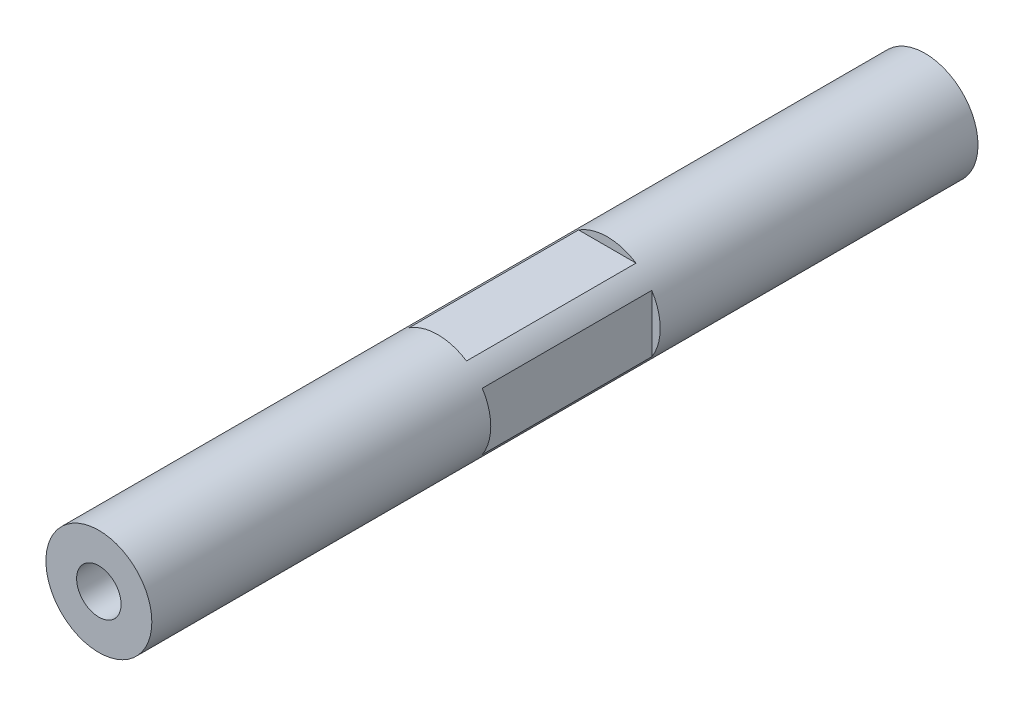
ISO-10303-21;
HEADER;
FILE_DESCRIPTION(('STEP AP214'),'2;1');
FILE_NAME('part.step','',(''),(''),'','','');
FILE_SCHEMA(('AUTOMOTIVE_DESIGN { 1 0 10303 214 1 1 1 1 }'));
ENDSEC;
DATA;
#1=APPLICATION_CONTEXT('core data for automotive mechanical design processes');
#2=APPLICATION_PROTOCOL_DEFINITION('international standard','automotive_design',2000,#1);
#3=PRODUCT_CONTEXT('',#1,'mechanical');
#4=PRODUCT('Part','Part','',(#3));
#5=PRODUCT_RELATED_PRODUCT_CATEGORY('part','',(#4));
#6=PRODUCT_DEFINITION_FORMATION('','',#4);
#7=PRODUCT_DEFINITION_CONTEXT('part definition',#1,'design');
#8=PRODUCT_DEFINITION('design','',#6,#7);
#9=PRODUCT_DEFINITION_SHAPE('','',#8);
#10=(LENGTH_UNIT() NAMED_UNIT(*) SI_UNIT(.MILLI.,.METRE.));
#11=(NAMED_UNIT(*) PLANE_ANGLE_UNIT() SI_UNIT($,.RADIAN.));
#12=(NAMED_UNIT(*) SI_UNIT($,.STERADIAN.) SOLID_ANGLE_UNIT());
#13=UNCERTAINTY_MEASURE_WITH_UNIT(LENGTH_MEASURE(1.E-05),#10,'distance_accuracy_value','');
#14=(GEOMETRIC_REPRESENTATION_CONTEXT(3) GLOBAL_UNCERTAINTY_ASSIGNED_CONTEXT((#13)) GLOBAL_UNIT_ASSIGNED_CONTEXT((#10,
#11,#12)) REPRESENTATION_CONTEXT('',''));
#15=CARTESIAN_POINT('',(0.,0.,0.));
#16=DIRECTION('',(0.,0.,1.));
#17=DIRECTION('',(1.,0.,0.));
#18=AXIS2_PLACEMENT_3D('',#15,#16,#17);
#19=CARTESIAN_POINT('',(0.,0.,78.));
#20=DIRECTION('',(0.,0.,-1.));
#21=DIRECTION('',(-1.,0.,0.));
#22=AXIS2_PLACEMENT_3D('',#19,#20,#21);
#23=CYLINDRICAL_SURFACE('',#22,5.);
#24=CARTESIAN_POINT('',(0.,0.,46.));
#25=DIRECTION('',(0.,0.,-1.));
#26=DIRECTION('',(-1.,0.,0.));
#27=AXIS2_PLACEMENT_3D('',#24,#25,#26);
#28=CIRCLE('',#27,5.);
#29=CARTESIAN_POINT('',(4.2,2.71293199325011,46.));
#30=VERTEX_POINT('',#29);
#31=CARTESIAN_POINT('',(4.2,-2.71293199325011,46.));
#32=VERTEX_POINT('',#31);
#33=EDGE_CURVE('E108',#30,#32,#28,.T.);
#34=ORIENTED_EDGE('',*,*,#33,.F.);
#35=DIRECTION('',(0.,0.,-1.));
#36=VECTOR('',#35,1.);
#37=CARTESIAN_POINT('',(4.2,2.71293199325011,78.));
#38=LINE('',#37,#36);
#39=CARTESIAN_POINT('',(4.2,2.71293199325011,30.));
#40=VERTEX_POINT('',#39);
#41=EDGE_CURVE('E122',#40,#30,#38,.F.);
#42=ORIENTED_EDGE('',*,*,#41,.F.);
#43=CARTESIAN_POINT('',(0.,0.,30.));
#44=DIRECTION('',(0.,0.,-1.));
#45=DIRECTION('',(-1.,0.,0.));
#46=AXIS2_PLACEMENT_3D('',#43,#44,#45);
#47=CIRCLE('',#46,5.);
#48=CARTESIAN_POINT('',(4.2,-2.71293199325011,30.));
#49=VERTEX_POINT('',#48);
#50=EDGE_CURVE('E124',#40,#49,#47,.T.);
#51=ORIENTED_EDGE('',*,*,#50,.T.);
#52=DIRECTION('',(0.,0.,-1.));
#53=VECTOR('',#52,1.);
#54=CARTESIAN_POINT('',(4.2,-2.71293199325011,78.));
#55=LINE('',#54,#53);
#56=EDGE_CURVE('E120',#32,#49,#55,.T.);
#57=ORIENTED_EDGE('',*,*,#56,.F.);
#58=EDGE_LOOP('',(#34,#42,#51,#57));
#59=FACE_BOUND('',#58,.T.);
#60=DIRECTION('',(0.,0.,-1.));
#61=VECTOR('',#60,1.);
#62=CARTESIAN_POINT('',(2.71293199325011,4.2,78.));
#63=LINE('',#62,#61);
#64=CARTESIAN_POINT('',(2.71293199325011,4.2,46.));
#65=VERTEX_POINT('',#64);
#66=CARTESIAN_POINT('',(2.71293199325011,4.2,30.));
#67=VERTEX_POINT('',#66);
#68=EDGE_CURVE('E130',#65,#67,#63,.T.);
#69=ORIENTED_EDGE('',*,*,#68,.F.);
#70=CARTESIAN_POINT('',(0.,0.,46.));
#71=DIRECTION('',(0.,0.,1.));
#72=DIRECTION('',(1.,0.,0.));
#73=AXIS2_PLACEMENT_3D('',#70,#71,#72);
#74=CIRCLE('',#73,5.);
#75=CARTESIAN_POINT('',(-2.71293199325011,4.2,46.));
#76=VERTEX_POINT('',#75);
#77=EDGE_CURVE('E127',#65,#76,#74,.T.);
#78=ORIENTED_EDGE('',*,*,#77,.T.);
#79=DIRECTION('',(0.,0.,-1.));
#80=VECTOR('',#79,1.);
#81=CARTESIAN_POINT('',(-2.71293199325011,4.2,78.));
#82=LINE('',#81,#80);
#83=CARTESIAN_POINT('',(-2.71293199325011,4.2,30.));
#84=VERTEX_POINT('',#83);
#85=EDGE_CURVE('E133',#84,#76,#82,.F.);
#86=ORIENTED_EDGE('',*,*,#85,.F.);
#87=CARTESIAN_POINT('',(0.,0.,30.));
#88=DIRECTION('',(0.,0.,1.));
#89=DIRECTION('',(1.,0.,0.));
#90=AXIS2_PLACEMENT_3D('',#87,#88,#89);
#91=CIRCLE('',#90,5.);
#92=EDGE_CURVE('E135',#67,#84,#91,.T.);
#93=ORIENTED_EDGE('',*,*,#92,.F.);
#94=EDGE_LOOP('',(#69,#78,#86,#93));
#95=FACE_BOUND('',#94,.T.);
#96=DIRECTION('',(0.,0.,-1.));
#97=VECTOR('',#96,1.);
#98=CARTESIAN_POINT('',(-4.2,2.71293199325011,78.));
#99=LINE('',#98,#97);
#100=CARTESIAN_POINT('',(-4.2,2.71293199325011,46.));
#101=VERTEX_POINT('',#100);
#102=CARTESIAN_POINT('',(-4.2,2.71293199325011,30.));
#103=VERTEX_POINT('',#102);
#104=EDGE_CURVE('E140',#101,#103,#99,.T.);
#105=ORIENTED_EDGE('',*,*,#104,.F.);
#106=CARTESIAN_POINT('',(0.,0.,46.));
#107=DIRECTION('',(0.,0.,1.));
#108=DIRECTION('',(1.,0.,0.));
#109=AXIS2_PLACEMENT_3D('',#106,#107,#108);
#110=CIRCLE('',#109,5.);
#111=CARTESIAN_POINT('',(-4.2,-2.71293199325011,46.));
#112=VERTEX_POINT('',#111);
#113=EDGE_CURVE('E137',#101,#112,#110,.T.);
#114=ORIENTED_EDGE('',*,*,#113,.T.);
#115=DIRECTION('',(0.,0.,-1.));
#116=VECTOR('',#115,1.);
#117=CARTESIAN_POINT('',(-4.2,-2.71293199325011,78.));
#118=LINE('',#117,#116);
#119=CARTESIAN_POINT('',(-4.2,-2.71293199325011,30.));
#120=VERTEX_POINT('',#119);
#121=EDGE_CURVE('E143',#120,#112,#118,.F.);
#122=ORIENTED_EDGE('',*,*,#121,.F.);
#123=CARTESIAN_POINT('',(0.,0.,30.));
#124=DIRECTION('',(0.,0.,1.));
#125=DIRECTION('',(1.,0.,0.));
#126=AXIS2_PLACEMENT_3D('',#123,#124,#125);
#127=CIRCLE('',#126,5.);
#128=EDGE_CURVE('E145',#103,#120,#127,.T.);
#129=ORIENTED_EDGE('',*,*,#128,.F.);
#130=EDGE_LOOP('',(#105,#114,#122,#129));
#131=FACE_BOUND('',#130,.T.);
#132=CARTESIAN_POINT('',(0.,0.,78.));
#133=DIRECTION('',(0.,0.,1.));
#134=DIRECTION('',(1.,0.,0.));
#135=AXIS2_PLACEMENT_3D('',#132,#133,#134);
#136=CIRCLE('',#135,5.);
#137=CARTESIAN_POINT('',(5.,0.,78.));
#138=VERTEX_POINT('',#137);
#139=EDGE_CURVE('E147',#138,#138,#136,.T.);
#140=ORIENTED_EDGE('',*,*,#139,.F.);
#141=EDGE_LOOP('',(#140));
#142=FACE_BOUND('',#141,.T.);
#143=CARTESIAN_POINT('',(0.,0.,0.));
#144=DIRECTION('',(0.,0.,1.));
#145=DIRECTION('',(1.,0.,0.));
#146=AXIS2_PLACEMENT_3D('',#143,#144,#145);
#147=CIRCLE('',#146,5.);
#148=CARTESIAN_POINT('',(5.,0.,0.));
#149=VERTEX_POINT('',#148);
#150=EDGE_CURVE('E148',#149,#149,#147,.T.);
#151=ORIENTED_EDGE('',*,*,#150,.T.);
#152=EDGE_LOOP('',(#151));
#153=FACE_BOUND('',#152,.T.);
#154=CARTESIAN_POINT('',(0.,0.,46.));
#155=DIRECTION('',(0.,0.,-1.));
#156=DIRECTION('',(-1.,0.,0.));
#157=AXIS2_PLACEMENT_3D('',#154,#155,#156);
#158=CIRCLE('',#157,5.);
#159=CARTESIAN_POINT('',(2.71293199325011,-4.2,46.));
#160=VERTEX_POINT('',#159);
#161=CARTESIAN_POINT('',(-2.71293199325011,-4.2,46.));
#162=VERTEX_POINT('',#161);
#163=EDGE_CURVE('E11',#160,#162,#158,.T.);
#164=ORIENTED_EDGE('',*,*,#163,.F.);
#165=DIRECTION('',(0.,0.,-1.));
#166=VECTOR('',#165,1.);
#167=CARTESIAN_POINT('',(2.71293199325011,-4.2,78.));
#168=LINE('',#167,#166);
#169=CARTESIAN_POINT('',(2.71293199325011,-4.2,30.));
#170=VERTEX_POINT('',#169);
#171=EDGE_CURVE('E107',#170,#160,#168,.F.);
#172=ORIENTED_EDGE('',*,*,#171,.F.);
#173=CARTESIAN_POINT('',(0.,0.,30.));
#174=DIRECTION('',(0.,0.,-1.));
#175=DIRECTION('',(-1.,0.,0.));
#176=AXIS2_PLACEMENT_3D('',#173,#174,#175);
#177=CIRCLE('',#176,5.);
#178=CARTESIAN_POINT('',(-2.71293199325011,-4.2,30.));
#179=VERTEX_POINT('',#178);
#180=EDGE_CURVE('E102',#170,#179,#177,.T.);
#181=ORIENTED_EDGE('',*,*,#180,.T.);
#182=DIRECTION('',(0.,0.,-1.));
#183=VECTOR('',#182,1.);
#184=CARTESIAN_POINT('',(-2.71293199325011,-4.2,78.));
#185=LINE('',#184,#183);
#186=EDGE_CURVE('E42',#162,#179,#185,.T.);
#187=ORIENTED_EDGE('',*,*,#186,.F.);
#188=EDGE_LOOP('',(#164,#172,#181,#187));
#189=FACE_BOUND('',#188,.T.);
#190=ADVANCED_FACE('F35',(#59,#95,#131,#142,#153,#189),#23,.T.);
#191=CARTESIAN_POINT('',(0.,0.,78.));
#192=DIRECTION('',(0.,0.,1.));
#193=DIRECTION('',(1.,0.,0.));
#194=AXIS2_PLACEMENT_3D('',#191,#192,#193);
#195=PLANE('',#194);
#196=CARTESIAN_POINT('',(0.,0.,78.));
#197=DIRECTION('',(0.,0.,1.));
#198=DIRECTION('',(1.,0.,0.));
#199=AXIS2_PLACEMENT_3D('',#196,#197,#198);
#200=CIRCLE('',#199,2.1);
#201=CARTESIAN_POINT('',(2.1,0.,78.));
#202=VERTEX_POINT('',#201);
#203=EDGE_CURVE('E156',#202,#202,#200,.T.);
#204=ORIENTED_EDGE('',*,*,#203,.F.);
#205=EDGE_LOOP('',(#204));
#206=FACE_BOUND('',#205,.T.);
#207=ORIENTED_EDGE('',*,*,#139,.T.);
#208=EDGE_LOOP('',(#207));
#209=FACE_BOUND('',#208,.T.);
#210=ADVANCED_FACE('F191',(#206,#209),#195,.T.);
#211=CARTESIAN_POINT('',(0.,0.,0.));
#212=DIRECTION('',(0.,0.,1.));
#213=DIRECTION('',(1.,0.,0.));
#214=AXIS2_PLACEMENT_3D('',#211,#212,#213);
#215=PLANE('',#214);
#216=CARTESIAN_POINT('',(0.,0.,0.));
#217=DIRECTION('',(0.,0.,-1.));
#218=DIRECTION('',(-1.,0.,0.));
#219=AXIS2_PLACEMENT_3D('',#216,#217,#218);
#220=CIRCLE('',#219,2.09999999999999);
#221=CARTESIAN_POINT('',(-2.09999999999999,0.,0.));
#222=VERTEX_POINT('',#221);
#223=EDGE_CURVE('E162',#222,#222,#220,.T.);
#224=ORIENTED_EDGE('',*,*,#223,.F.);
#225=EDGE_LOOP('',(#224));
#226=FACE_BOUND('',#225,.T.);
#227=ORIENTED_EDGE('',*,*,#150,.F.);
#228=EDGE_LOOP('',(#227));
#229=FACE_BOUND('',#228,.T.);
#230=ADVANCED_FACE('F196',(#226,#229),#215,.F.);
#231=CARTESIAN_POINT('',(0.,0.,65.6));
#232=DIRECTION('',(0.,0.,1.));
#233=DIRECTION('',(1.,0.,0.));
#234=AXIS2_PLACEMENT_3D('',#231,#232,#233);
#235=CONICAL_SURFACE('',#234,2.1,1.02974425867666);
#236=CARTESIAN_POINT('',(0.,0.,64.3381927000421));
#237=VERTEX_POINT('',#236);
#238=VERTEX_LOOP('',#237);
#239=FACE_BOUND('',#238,.T.);
#240=CARTESIAN_POINT('',(0.,0.,65.6));
#241=DIRECTION('',(0.,0.,1.));
#242=DIRECTION('',(1.,0.,0.));
#243=AXIS2_PLACEMENT_3D('',#240,#241,#242);
#244=CIRCLE('',#243,2.1);
#245=CARTESIAN_POINT('',(2.1,0.,65.6));
#246=VERTEX_POINT('',#245);
#247=EDGE_CURVE('E151',#246,#246,#244,.T.);
#248=ORIENTED_EDGE('',*,*,#247,.T.);
#249=EDGE_LOOP('',(#248));
#250=FACE_BOUND('',#249,.T.);
#251=ADVANCED_FACE('F214',(#239,#250),#235,.F.);
#252=CARTESIAN_POINT('',(0.,0.,78.));
#253=DIRECTION('',(0.,0.,1.));
#254=DIRECTION('',(1.,0.,0.));
#255=AXIS2_PLACEMENT_3D('',#252,#253,#254);
#256=CYLINDRICAL_SURFACE('',#255,2.1);
#257=ORIENTED_EDGE('',*,*,#247,.F.);
#258=EDGE_LOOP('',(#257));
#259=FACE_BOUND('',#258,.T.);
#260=ORIENTED_EDGE('',*,*,#203,.T.);
#261=EDGE_LOOP('',(#260));
#262=FACE_BOUND('',#261,.T.);
#263=ADVANCED_FACE('F219',(#259,#262),#256,.F.);
#264=CARTESIAN_POINT('',(0.,0.,12.4));
#265=DIRECTION('',(0.,0.,-1.));
#266=DIRECTION('',(-1.,0.,0.));
#267=AXIS2_PLACEMENT_3D('',#264,#265,#266);
#268=CONICAL_SURFACE('',#267,2.09999999999999,1.02974425867665);
#269=CARTESIAN_POINT('',(0.,0.,13.6618072999579));
#270=VERTEX_POINT('',#269);
#271=VERTEX_LOOP('',#270);
#272=FACE_BOUND('',#271,.T.);
#273=CARTESIAN_POINT('',(0.,0.,12.4));
#274=DIRECTION('',(0.,0.,-1.));
#275=DIRECTION('',(-1.,0.,0.));
#276=AXIS2_PLACEMENT_3D('',#273,#274,#275);
#277=CIRCLE('',#276,2.09999999999999);
#278=CARTESIAN_POINT('',(-2.09999999999999,0.,12.4));
#279=VERTEX_POINT('',#278);
#280=EDGE_CURVE('E159',#279,#279,#277,.T.);
#281=ORIENTED_EDGE('',*,*,#280,.T.);
#282=EDGE_LOOP('',(#281));
#283=FACE_BOUND('',#282,.T.);
#284=ADVANCED_FACE('F226',(#272,#283),#268,.F.);
#285=CARTESIAN_POINT('',(0.,0.,0.));
#286=DIRECTION('',(0.,0.,-1.));
#287=DIRECTION('',(-1.,0.,0.));
#288=AXIS2_PLACEMENT_3D('',#285,#286,#287);
#289=CYLINDRICAL_SURFACE('',#288,2.09999999999999);
#290=ORIENTED_EDGE('',*,*,#280,.F.);
#291=EDGE_LOOP('',(#290));
#292=FACE_BOUND('',#291,.T.);
#293=ORIENTED_EDGE('',*,*,#223,.T.);
#294=EDGE_LOOP('',(#293));
#295=FACE_BOUND('',#294,.T.);
#296=ADVANCED_FACE('F230',(#292,#295),#289,.F.);
#297=CARTESIAN_POINT('',(-4.2,3.54575930009836,46.));
#298=DIRECTION('',(-1.,0.,0.));
#299=DIRECTION('',(0.,-1.,0.));
#300=AXIS2_PLACEMENT_3D('',#297,#298,#299);
#301=PLANE('',#300);
#302=ORIENTED_EDGE('',*,*,#104,.T.);
#303=DIRECTION('',(0.,1.,0.));
#304=VECTOR('',#303,1.);
#305=CARTESIAN_POINT('',(-4.2,3.54575930009836,30.));
#306=LINE('',#305,#304);
#307=EDGE_CURVE('E168',#120,#103,#306,.T.);
#308=ORIENTED_EDGE('',*,*,#307,.F.);
#309=ORIENTED_EDGE('',*,*,#121,.T.);
#310=DIRECTION('',(0.,1.,0.));
#311=VECTOR('',#310,1.);
#312=CARTESIAN_POINT('',(-4.2,3.54575930009836,46.));
#313=LINE('',#312,#311);
#314=EDGE_CURVE('E165',#112,#101,#313,.T.);
#315=ORIENTED_EDGE('',*,*,#314,.T.);
#316=EDGE_LOOP('',(#302,#308,#309,#315));
#317=FACE_BOUND('',#316,.T.);
#318=ADVANCED_FACE('F234',(#317),#301,.T.);
#319=CARTESIAN_POINT('',(-11.7059503356162,-4.42550165284454,46.));
#320=DIRECTION('',(0.,0.,1.));
#321=DIRECTION('',(1.,0.,0.));
#322=AXIS2_PLACEMENT_3D('',#319,#320,#321);
#323=PLANE('',#322);
#324=ORIENTED_EDGE('',*,*,#314,.F.);
#325=ORIENTED_EDGE('',*,*,#113,.F.);
#326=EDGE_LOOP('',(#324,#325));
#327=FACE_BOUND('',#326,.T.);
#328=ADVANCED_FACE('F238',(#327),#323,.F.);
#329=CARTESIAN_POINT('',(-11.7059503356162,-4.42550165284454,30.));
#330=DIRECTION('',(0.,0.,1.));
#331=DIRECTION('',(1.,0.,0.));
#332=AXIS2_PLACEMENT_3D('',#329,#330,#331);
#333=PLANE('',#332);
#334=ORIENTED_EDGE('',*,*,#128,.T.);
#335=ORIENTED_EDGE('',*,*,#307,.T.);
#336=EDGE_LOOP('',(#334,#335));
#337=FACE_BOUND('',#336,.T.);
#338=ADVANCED_FACE('F242',(#337),#333,.T.);
#339=CARTESIAN_POINT('',(-3.41037992427372,4.2,46.));
#340=DIRECTION('',(0.,1.,0.));
#341=DIRECTION('',(0.,0.,1.));
#342=AXIS2_PLACEMENT_3D('',#339,#340,#341);
#343=PLANE('',#342);
#344=ORIENTED_EDGE('',*,*,#68,.T.);
#345=DIRECTION('',(1.,0.,0.));
#346=VECTOR('',#345,1.);
#347=CARTESIAN_POINT('',(-3.41037992427372,4.2,30.));
#348=LINE('',#347,#346);
#349=EDGE_CURVE('E173',#84,#67,#348,.T.);
#350=ORIENTED_EDGE('',*,*,#349,.F.);
#351=ORIENTED_EDGE('',*,*,#85,.T.);
#352=DIRECTION('',(1.,0.,0.));
#353=VECTOR('',#352,1.);
#354=CARTESIAN_POINT('',(-3.41037992427372,4.2,46.));
#355=LINE('',#354,#353);
#356=EDGE_CURVE('E170',#76,#65,#355,.T.);
#357=ORIENTED_EDGE('',*,*,#356,.T.);
#358=EDGE_LOOP('',(#344,#350,#351,#357));
#359=FACE_BOUND('',#358,.T.);
#360=ADVANCED_FACE('F246',(#359),#343,.T.);
#361=CARTESIAN_POINT('',(-3.41037992427372,4.2,46.));
#362=DIRECTION('',(0.,0.,1.));
#363=DIRECTION('',(1.,0.,0.));
#364=AXIS2_PLACEMENT_3D('',#361,#362,#363);
#365=PLANE('',#364);
#366=ORIENTED_EDGE('',*,*,#356,.F.);
#367=ORIENTED_EDGE('',*,*,#77,.F.);
#368=EDGE_LOOP('',(#366,#367));
#369=FACE_BOUND('',#368,.T.);
#370=ADVANCED_FACE('F250',(#369),#365,.F.);
#371=CARTESIAN_POINT('',(-3.41037992427372,4.2,30.));
#372=DIRECTION('',(0.,0.,1.));
#373=DIRECTION('',(1.,0.,0.));
#374=AXIS2_PLACEMENT_3D('',#371,#372,#373);
#375=PLANE('',#374);
#376=ORIENTED_EDGE('',*,*,#92,.T.);
#377=ORIENTED_EDGE('',*,*,#349,.T.);
#378=EDGE_LOOP('',(#376,#377));
#379=FACE_BOUND('',#378,.T.);
#380=ADVANCED_FACE('F254',(#379),#375,.T.);
#381=CARTESIAN_POINT('',(4.2,3.54575930009835,46.));
#382=DIRECTION('',(1.,0.,0.));
#383=DIRECTION('',(0.,1.,0.));
#384=AXIS2_PLACEMENT_3D('',#381,#382,#383);
#385=PLANE('',#384);
#386=ORIENTED_EDGE('',*,*,#56,.T.);
#387=DIRECTION('',(0.,-1.,0.));
#388=VECTOR('',#387,1.);
#389=CARTESIAN_POINT('',(4.2,3.54575930009835,30.));
#390=LINE('',#389,#388);
#391=EDGE_CURVE('E55',#40,#49,#390,.T.);
#392=ORIENTED_EDGE('',*,*,#391,.F.);
#393=ORIENTED_EDGE('',*,*,#41,.T.);
#394=DIRECTION('',(0.,-1.,0.));
#395=VECTOR('',#394,1.);
#396=CARTESIAN_POINT('',(4.2,3.54575930009835,46.));
#397=LINE('',#396,#395);
#398=EDGE_CURVE('E175',#30,#32,#397,.T.);
#399=ORIENTED_EDGE('',*,*,#398,.T.);
#400=EDGE_LOOP('',(#386,#392,#393,#399));
#401=FACE_BOUND('',#400,.T.);
#402=ADVANCED_FACE('F258',(#401),#385,.T.);
#403=CARTESIAN_POINT('',(10.6760201131167,-3.83847080747277,46.));
#404=DIRECTION('',(0.,0.,-1.));
#405=DIRECTION('',(-1.,0.,0.));
#406=AXIS2_PLACEMENT_3D('',#403,#404,#405);
#407=PLANE('',#406);
#408=ORIENTED_EDGE('',*,*,#33,.T.);
#409=ORIENTED_EDGE('',*,*,#398,.F.);
#410=EDGE_LOOP('',(#408,#409));
#411=FACE_BOUND('',#410,.T.);
#412=ADVANCED_FACE('F262',(#411),#407,.T.);
#413=CARTESIAN_POINT('',(10.6760201131167,-3.83847080747277,30.));
#414=DIRECTION('',(0.,0.,-1.));
#415=DIRECTION('',(-1.,0.,0.));
#416=AXIS2_PLACEMENT_3D('',#413,#414,#415);
#417=PLANE('',#416);
#418=ORIENTED_EDGE('',*,*,#391,.T.);
#419=ORIENTED_EDGE('',*,*,#50,.F.);
#420=EDGE_LOOP('',(#418,#419));
#421=FACE_BOUND('',#420,.T.);
#422=ADVANCED_FACE('F188',(#421),#417,.F.);
#423=CARTESIAN_POINT('',(-3.55092745524015,-4.2,46.));
#424=DIRECTION('',(0.,-1.,0.));
#425=DIRECTION('',(0.,0.,-1.));
#426=AXIS2_PLACEMENT_3D('',#423,#424,#425);
#427=PLANE('',#426);
#428=ORIENTED_EDGE('',*,*,#186,.T.);
#429=DIRECTION('',(-1.,0.,0.));
#430=VECTOR('',#429,1.);
#431=CARTESIAN_POINT('',(-3.55092745524015,-4.2,30.));
#432=LINE('',#431,#430);
#433=EDGE_CURVE('E48',#170,#179,#432,.T.);
#434=ORIENTED_EDGE('',*,*,#433,.F.);
#435=ORIENTED_EDGE('',*,*,#171,.T.);
#436=DIRECTION('',(-1.,0.,0.));
#437=VECTOR('',#436,1.);
#438=CARTESIAN_POINT('',(-3.55092745524015,-4.2,46.));
#439=LINE('',#438,#437);
#440=EDGE_CURVE('E114',#160,#162,#439,.T.);
#441=ORIENTED_EDGE('',*,*,#440,.T.);
#442=EDGE_LOOP('',(#428,#434,#435,#441));
#443=FACE_BOUND('',#442,.T.);
#444=ADVANCED_FACE('F111',(#443),#427,.T.);
#445=CARTESIAN_POINT('',(-3.55092745524015,-4.2,46.));
#446=DIRECTION('',(0.,0.,-1.));
#447=DIRECTION('',(-1.,0.,0.));
#448=AXIS2_PLACEMENT_3D('',#445,#446,#447);
#449=PLANE('',#448);
#450=ORIENTED_EDGE('',*,*,#163,.T.);
#451=ORIENTED_EDGE('',*,*,#440,.F.);
#452=EDGE_LOOP('',(#450,#451));
#453=FACE_BOUND('',#452,.T.);
#454=ADVANCED_FACE('F180',(#453),#449,.T.);
#455=CARTESIAN_POINT('',(-3.55092745524015,-4.2,30.));
#456=DIRECTION('',(0.,0.,-1.));
#457=DIRECTION('',(-1.,0.,0.));
#458=AXIS2_PLACEMENT_3D('',#455,#456,#457);
#459=PLANE('',#458);
#460=ORIENTED_EDGE('',*,*,#433,.T.);
#461=ORIENTED_EDGE('',*,*,#180,.F.);
#462=EDGE_LOOP('',(#460,#461));
#463=FACE_BOUND('',#462,.T.);
#464=ADVANCED_FACE('F103',(#463),#459,.F.);
#465=CLOSED_SHELL('',(#190,#210,#230,#251,#263,#284,#296,#318,#328,#338,#360,#370,#380,#402,
#412,#422,#444,#454,#464));
#466=MANIFOLD_SOLID_BREP('B2',#465);
#467=ADVANCED_BREP_SHAPE_REPRESENTATION('',(#18,#466),#14);
#468=SHAPE_DEFINITION_REPRESENTATION(#9,#467);
ENDSEC;
END-ISO-10303-21;
